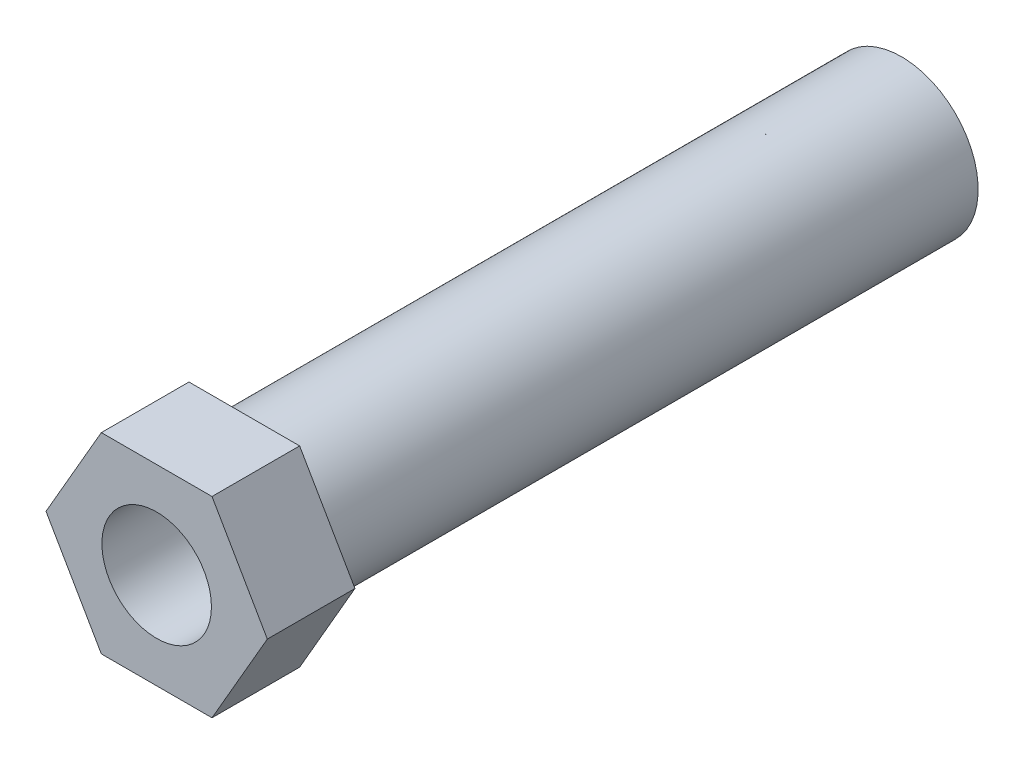
ISO-10303-21;
HEADER;
FILE_DESCRIPTION(('STEP AP214'),'2;1');
FILE_NAME('part.step','',(''),(''),'','','');
FILE_SCHEMA(('AUTOMOTIVE_DESIGN { 1 0 10303 214 1 1 1 1 }'));
ENDSEC;
DATA;
#1=APPLICATION_CONTEXT('core data for automotive mechanical design processes');
#2=APPLICATION_PROTOCOL_DEFINITION('international standard','automotive_design',2000,#1);
#3=PRODUCT_CONTEXT('',#1,'mechanical');
#4=PRODUCT('Part','Part','',(#3));
#5=PRODUCT_RELATED_PRODUCT_CATEGORY('part','',(#4));
#6=PRODUCT_DEFINITION_FORMATION('','',#4);
#7=PRODUCT_DEFINITION_CONTEXT('part definition',#1,'design');
#8=PRODUCT_DEFINITION('design','',#6,#7);
#9=PRODUCT_DEFINITION_SHAPE('','',#8);
#10=(LENGTH_UNIT() NAMED_UNIT(*) SI_UNIT(.MILLI.,.METRE.));
#11=(NAMED_UNIT(*) PLANE_ANGLE_UNIT() SI_UNIT($,.RADIAN.));
#12=(NAMED_UNIT(*) SI_UNIT($,.STERADIAN.) SOLID_ANGLE_UNIT());
#13=UNCERTAINTY_MEASURE_WITH_UNIT(LENGTH_MEASURE(1.E-05),#10,'distance_accuracy_value','');
#14=(GEOMETRIC_REPRESENTATION_CONTEXT(3) GLOBAL_UNCERTAINTY_ASSIGNED_CONTEXT((#13)) GLOBAL_UNIT_ASSIGNED_CONTEXT((#10,
#11,#12)) REPRESENTATION_CONTEXT('',''));
#15=CARTESIAN_POINT('',(0.,0.,0.));
#16=DIRECTION('',(0.,0.,1.));
#17=DIRECTION('',(1.,0.,0.));
#18=AXIS2_PLACEMENT_3D('',#15,#16,#17);
#19=CARTESIAN_POINT('',(2.5259074277046,-4.37500000000002,4.));
#20=DIRECTION('',(-0.866025403784438,0.5,0.));
#21=DIRECTION('',(-0.5,-0.866025403784438,0.));
#22=AXIS2_PLACEMENT_3D('',#19,#20,#21);
#23=PLANE('',#22);
#24=DIRECTION('',(0.5,0.866025403784438,0.));
#25=VECTOR('',#24,1.);
#26=CARTESIAN_POINT('',(2.5259074277046,-4.37500000000002,0.));
#27=LINE('',#26,#25);
#28=CARTESIAN_POINT('',(2.5259074277046,-4.37500000000002,0.));
#29=VERTEX_POINT('',#28);
#30=CARTESIAN_POINT('',(5.05181485540923,0.,0.));
#31=VERTEX_POINT('',#30);
#32=EDGE_CURVE('E132',#29,#31,#27,.T.);
#33=ORIENTED_EDGE('',*,*,#32,.T.);
#34=DIRECTION('',(0.,0.,-1.));
#35=VECTOR('',#34,1.);
#36=CARTESIAN_POINT('',(5.05181485540923,0.,4.));
#37=LINE('',#36,#35);
#38=CARTESIAN_POINT('',(5.05181485540923,0.,4.));
#39=VERTEX_POINT('',#38);
#40=EDGE_CURVE('E50',#39,#31,#37,.T.);
#41=ORIENTED_EDGE('',*,*,#40,.F.);
#42=DIRECTION('',(0.5,0.866025403784438,0.));
#43=VECTOR('',#42,1.);
#44=CARTESIAN_POINT('',(2.5259074277046,-4.37500000000002,4.));
#45=LINE('',#44,#43);
#46=CARTESIAN_POINT('',(2.5259074277046,-4.37500000000002,4.));
#47=VERTEX_POINT('',#46);
#48=EDGE_CURVE('E155',#47,#39,#45,.T.);
#49=ORIENTED_EDGE('',*,*,#48,.F.);
#50=DIRECTION('',(0.,0.,-1.));
#51=VECTOR('',#50,1.);
#52=CARTESIAN_POINT('',(2.5259074277046,-4.37500000000002,4.));
#53=LINE('',#52,#51);
#54=EDGE_CURVE('E134',#47,#29,#53,.T.);
#55=ORIENTED_EDGE('',*,*,#54,.T.);
#56=EDGE_LOOP('',(#33,#41,#49,#55));
#57=FACE_BOUND('',#56,.T.);
#58=ADVANCED_FACE('F42',(#57),#23,.F.);
#59=CARTESIAN_POINT('',(5.05181485540923,0.,4.));
#60=DIRECTION('',(-0.866025403784439,-0.5,0.));
#61=DIRECTION('',(0.5,-0.866025403784439,0.));
#62=AXIS2_PLACEMENT_3D('',#59,#60,#61);
#63=PLANE('',#62);
#64=DIRECTION('',(-0.5,0.866025403784439,0.));
#65=VECTOR('',#64,1.);
#66=CARTESIAN_POINT('',(5.05181485540923,0.,0.));
#67=LINE('',#66,#65);
#68=CARTESIAN_POINT('',(2.5259074277046,4.37500000000004,0.));
#69=VERTEX_POINT('',#68);
#70=EDGE_CURVE('E138',#31,#69,#67,.T.);
#71=ORIENTED_EDGE('',*,*,#70,.T.);
#72=DIRECTION('',(0.,0.,-1.));
#73=VECTOR('',#72,1.);
#74=CARTESIAN_POINT('',(2.5259074277046,4.37500000000004,4.));
#75=LINE('',#74,#73);
#76=CARTESIAN_POINT('',(2.5259074277046,4.37500000000004,4.));
#77=VERTEX_POINT('',#76);
#78=EDGE_CURVE('E158',#77,#69,#75,.T.);
#79=ORIENTED_EDGE('',*,*,#78,.F.);
#80=DIRECTION('',(-0.5,0.866025403784439,0.));
#81=VECTOR('',#80,1.);
#82=CARTESIAN_POINT('',(5.05181485540923,0.,4.));
#83=LINE('',#82,#81);
#84=EDGE_CURVE('E99',#39,#77,#83,.T.);
#85=ORIENTED_EDGE('',*,*,#84,.F.);
#86=ORIENTED_EDGE('',*,*,#40,.T.);
#87=EDGE_LOOP('',(#71,#79,#85,#86));
#88=FACE_BOUND('',#87,.T.);
#89=ADVANCED_FACE('F164',(#88),#63,.F.);
#90=CARTESIAN_POINT('',(2.5259074277046,4.37500000000004,4.));
#91=DIRECTION('',(0.,-1.,0.));
#92=DIRECTION('',(1.,0.,0.));
#93=AXIS2_PLACEMENT_3D('',#90,#91,#92);
#94=PLANE('',#93);
#95=DIRECTION('',(-1.,0.,0.));
#96=VECTOR('',#95,1.);
#97=CARTESIAN_POINT('',(2.5259074277046,4.37500000000004,0.));
#98=LINE('',#97,#96);
#99=CARTESIAN_POINT('',(-2.52590742770461,4.37500000000003,0.));
#100=VERTEX_POINT('',#99);
#101=EDGE_CURVE('E141',#69,#100,#98,.T.);
#102=ORIENTED_EDGE('',*,*,#101,.T.);
#103=DIRECTION('',(0.,0.,-1.));
#104=VECTOR('',#103,1.);
#105=CARTESIAN_POINT('',(-2.52590742770461,4.37500000000003,4.));
#106=LINE('',#105,#104);
#107=CARTESIAN_POINT('',(-2.52590742770461,4.37500000000003,4.));
#108=VERTEX_POINT('',#107);
#109=EDGE_CURVE('E123',#108,#100,#106,.T.);
#110=ORIENTED_EDGE('',*,*,#109,.F.);
#111=DIRECTION('',(-1.,0.,0.));
#112=VECTOR('',#111,1.);
#113=CARTESIAN_POINT('',(2.5259074277046,4.37500000000004,4.));
#114=LINE('',#113,#112);
#115=EDGE_CURVE('E114',#77,#108,#114,.T.);
#116=ORIENTED_EDGE('',*,*,#115,.F.);
#117=ORIENTED_EDGE('',*,*,#78,.T.);
#118=EDGE_LOOP('',(#102,#110,#116,#117));
#119=FACE_BOUND('',#118,.T.);
#120=ADVANCED_FACE('F174',(#119),#94,.F.);
#121=CARTESIAN_POINT('',(-2.52590742770461,4.37500000000003,4.));
#122=DIRECTION('',(0.866025403784439,-0.5,0.));
#123=DIRECTION('',(0.5,0.866025403784439,0.));
#124=AXIS2_PLACEMENT_3D('',#121,#122,#123);
#125=PLANE('',#124);
#126=DIRECTION('',(-0.5,-0.866025403784438,0.));
#127=VECTOR('',#126,1.);
#128=CARTESIAN_POINT('',(-2.52590742770461,4.37500000000003,0.));
#129=LINE('',#128,#127);
#130=CARTESIAN_POINT('',(-5.05181485540925,0.,0.));
#131=VERTEX_POINT('',#130);
#132=EDGE_CURVE('E122',#100,#131,#129,.T.);
#133=ORIENTED_EDGE('',*,*,#132,.T.);
#134=DIRECTION('',(0.,0.,-1.));
#135=VECTOR('',#134,1.);
#136=CARTESIAN_POINT('',(-5.05181485540925,0.,4.));
#137=LINE('',#136,#135);
#138=CARTESIAN_POINT('',(-5.05181485540925,0.,4.));
#139=VERTEX_POINT('',#138);
#140=EDGE_CURVE('E118',#139,#131,#137,.T.);
#141=ORIENTED_EDGE('',*,*,#140,.F.);
#142=DIRECTION('',(-0.5,-0.866025403784438,0.));
#143=VECTOR('',#142,1.);
#144=CARTESIAN_POINT('',(-2.52590742770461,4.37500000000003,4.));
#145=LINE('',#144,#143);
#146=EDGE_CURVE('E110',#108,#139,#145,.T.);
#147=ORIENTED_EDGE('',*,*,#146,.F.);
#148=ORIENTED_EDGE('',*,*,#109,.T.);
#149=EDGE_LOOP('',(#133,#141,#147,#148));
#150=FACE_BOUND('',#149,.T.);
#151=ADVANCED_FACE('F117',(#150),#125,.F.);
#152=CARTESIAN_POINT('',(-5.05181485540925,0.,4.));
#153=DIRECTION('',(0.866025403784439,0.5,0.));
#154=DIRECTION('',(-0.5,0.866025403784439,0.));
#155=AXIS2_PLACEMENT_3D('',#152,#153,#154);
#156=PLANE('',#155);
#157=DIRECTION('',(0.499999999999999,-0.866025403784439,0.));
#158=VECTOR('',#157,1.);
#159=CARTESIAN_POINT('',(-5.05181485540925,0.,0.));
#160=LINE('',#159,#158);
#161=CARTESIAN_POINT('',(-2.52590742770463,-4.37500000000002,0.));
#162=VERTEX_POINT('',#161);
#163=EDGE_CURVE('E85',#131,#162,#160,.T.);
#164=ORIENTED_EDGE('',*,*,#163,.T.);
#165=DIRECTION('',(0.,0.,-1.));
#166=VECTOR('',#165,1.);
#167=CARTESIAN_POINT('',(-2.52590742770463,-4.37500000000002,4.));
#168=LINE('',#167,#166);
#169=CARTESIAN_POINT('',(-2.52590742770463,-4.37500000000002,4.));
#170=VERTEX_POINT('',#169);
#171=EDGE_CURVE('E125',#170,#162,#168,.T.);
#172=ORIENTED_EDGE('',*,*,#171,.F.);
#173=DIRECTION('',(0.499999999999999,-0.866025403784439,0.));
#174=VECTOR('',#173,1.);
#175=CARTESIAN_POINT('',(-5.05181485540925,0.,4.));
#176=LINE('',#175,#174);
#177=EDGE_CURVE('E112',#139,#170,#176,.T.);
#178=ORIENTED_EDGE('',*,*,#177,.F.);
#179=ORIENTED_EDGE('',*,*,#140,.T.);
#180=EDGE_LOOP('',(#164,#172,#178,#179));
#181=FACE_BOUND('',#180,.T.);
#182=ADVANCED_FACE('F130',(#181),#156,.F.);
#183=CARTESIAN_POINT('',(-2.52590742770463,-4.37500000000002,4.));
#184=DIRECTION('',(0.,1.,0.));
#185=DIRECTION('',(0.,0.,1.));
#186=AXIS2_PLACEMENT_3D('',#183,#184,#185);
#187=PLANE('',#186);
#188=DIRECTION('',(1.,0.,0.));
#189=VECTOR('',#188,1.);
#190=CARTESIAN_POINT('',(-2.52590742770463,-4.37500000000002,0.));
#191=LINE('',#190,#189);
#192=EDGE_CURVE('E93',#162,#29,#191,.T.);
#193=ORIENTED_EDGE('',*,*,#192,.T.);
#194=ORIENTED_EDGE('',*,*,#54,.F.);
#195=DIRECTION('',(1.,0.,0.));
#196=VECTOR('',#195,1.);
#197=CARTESIAN_POINT('',(-2.52590742770463,-4.37500000000002,4.));
#198=LINE('',#197,#196);
#199=EDGE_CURVE('E61',#170,#47,#198,.T.);
#200=ORIENTED_EDGE('',*,*,#199,.F.);
#201=ORIENTED_EDGE('',*,*,#171,.T.);
#202=EDGE_LOOP('',(#193,#194,#200,#201));
#203=FACE_BOUND('',#202,.T.);
#204=ADVANCED_FACE('F194',(#203),#187,.F.);
#205=CARTESIAN_POINT('',(0.,0.,4.));
#206=DIRECTION('',(0.,0.,1.));
#207=DIRECTION('',(1.,0.,0.));
#208=AXIS2_PLACEMENT_3D('',#205,#206,#207);
#209=PLANE('',#208);
#210=CARTESIAN_POINT('',(0.,0.,4.));
#211=DIRECTION('',(0.,0.,1.));
#212=DIRECTION('',(1.,0.,0.));
#213=AXIS2_PLACEMENT_3D('',#210,#211,#212);
#214=CIRCLE('',#213,2.5);
#215=CARTESIAN_POINT('',(2.5,0.,4.));
#216=VERTEX_POINT('',#215);
#217=EDGE_CURVE('E183',#216,#216,#214,.T.);
#218=ORIENTED_EDGE('',*,*,#217,.F.);
#219=EDGE_LOOP('',(#218));
#220=FACE_BOUND('',#219,.T.);
#221=ORIENTED_EDGE('',*,*,#48,.T.);
#222=ORIENTED_EDGE('',*,*,#84,.T.);
#223=ORIENTED_EDGE('',*,*,#115,.T.);
#224=ORIENTED_EDGE('',*,*,#146,.T.);
#225=ORIENTED_EDGE('',*,*,#177,.T.);
#226=ORIENTED_EDGE('',*,*,#199,.T.);
#227=EDGE_LOOP('',(#221,#222,#223,#224,#225,#226));
#228=FACE_BOUND('',#227,.T.);
#229=ADVANCED_FACE('F108',(#220,#228),#209,.T.);
#230=CARTESIAN_POINT('',(0.,0.,0.));
#231=DIRECTION('',(0.,0.,1.));
#232=DIRECTION('',(1.,0.,0.));
#233=AXIS2_PLACEMENT_3D('',#230,#231,#232);
#234=PLANE('',#233);
#235=CARTESIAN_POINT('',(0.,0.,0.));
#236=DIRECTION('',(0.,0.,-1.));
#237=DIRECTION('',(-1.,0.,0.));
#238=AXIS2_PLACEMENT_3D('',#235,#236,#237);
#239=CIRCLE('',#238,3.5);
#240=CARTESIAN_POINT('',(-3.5,0.,0.));
#241=VERTEX_POINT('',#240);
#242=EDGE_CURVE('E11',#241,#241,#239,.T.);
#243=ORIENTED_EDGE('',*,*,#242,.F.);
#244=EDGE_LOOP('',(#243));
#245=FACE_BOUND('',#244,.T.);
#246=ORIENTED_EDGE('',*,*,#32,.F.);
#247=ORIENTED_EDGE('',*,*,#192,.F.);
#248=ORIENTED_EDGE('',*,*,#163,.F.);
#249=ORIENTED_EDGE('',*,*,#132,.F.);
#250=ORIENTED_EDGE('',*,*,#101,.F.);
#251=ORIENTED_EDGE('',*,*,#70,.F.);
#252=EDGE_LOOP('',(#246,#247,#248,#249,#250,#251));
#253=FACE_BOUND('',#252,.T.);
#254=ADVANCED_FACE('F168',(#245,#253),#234,.F.);
#255=CARTESIAN_POINT('',(0.,0.,-30.));
#256=DIRECTION('',(0.,0.,-1.));
#257=DIRECTION('',(-1.,0.,0.));
#258=AXIS2_PLACEMENT_3D('',#255,#256,#257);
#259=PLANE('',#258);
#260=CARTESIAN_POINT('',(0.,0.,-30.));
#261=DIRECTION('',(0.,0.,-1.));
#262=DIRECTION('',(-1.,0.,0.));
#263=AXIS2_PLACEMENT_3D('',#260,#261,#262);
#264=CIRCLE('',#263,3.5);
#265=CARTESIAN_POINT('',(-3.5,0.,-30.));
#266=VERTEX_POINT('',#265);
#267=EDGE_CURVE('E140',#266,#266,#264,.T.);
#268=ORIENTED_EDGE('',*,*,#267,.T.);
#269=EDGE_LOOP('',(#268));
#270=FACE_BOUND('',#269,.T.);
#271=CARTESIAN_POINT('',(0.,0.,-30.));
#272=DIRECTION('',(0.,0.,-1.));
#273=DIRECTION('',(-1.,0.,0.));
#274=AXIS2_PLACEMENT_3D('',#271,#272,#273);
#275=CIRCLE('',#274,2.5);
#276=CARTESIAN_POINT('',(-2.5,0.,-30.));
#277=VERTEX_POINT('',#276);
#278=EDGE_CURVE('E182',#277,#277,#275,.T.);
#279=ORIENTED_EDGE('',*,*,#278,.F.);
#280=EDGE_LOOP('',(#279));
#281=FACE_BOUND('',#280,.T.);
#282=ADVANCED_FACE('F199',(#270,#281),#259,.T.);
#283=CARTESIAN_POINT('',(0.,0.,-30.));
#284=DIRECTION('',(0.,0.,1.));
#285=DIRECTION('',(1.,0.,0.));
#286=AXIS2_PLACEMENT_3D('',#283,#284,#285);
#287=CYLINDRICAL_SURFACE('',#286,3.5);
#288=ORIENTED_EDGE('',*,*,#267,.F.);
#289=EDGE_LOOP('',(#288));
#290=FACE_BOUND('',#289,.T.);
#291=ORIENTED_EDGE('',*,*,#242,.T.);
#292=EDGE_LOOP('',(#291));
#293=FACE_BOUND('',#292,.T.);
#294=ADVANCED_FACE('F236',(#290,#293),#287,.T.);
#295=CARTESIAN_POINT('',(0.,0.,-30.));
#296=DIRECTION('',(0.,0.,1.));
#297=DIRECTION('',(1.,0.,0.));
#298=AXIS2_PLACEMENT_3D('',#295,#296,#297);
#299=CYLINDRICAL_SURFACE('',#298,2.5);
#300=ORIENTED_EDGE('',*,*,#278,.T.);
#301=EDGE_LOOP('',(#300));
#302=FACE_BOUND('',#301,.T.);
#303=ORIENTED_EDGE('',*,*,#217,.T.);
#304=EDGE_LOOP('',(#303));
#305=FACE_BOUND('',#304,.T.);
#306=ADVANCED_FACE('F187',(#302,#305),#299,.F.);
#307=CLOSED_SHELL('',(#58,#89,#120,#151,#182,#204,#229,#254,#282,#294,#306));
#308=MANIFOLD_SOLID_BREP('B2',#307);
#309=ADVANCED_BREP_SHAPE_REPRESENTATION('',(#18,#308),#14);
#310=SHAPE_DEFINITION_REPRESENTATION(#9,#309);
ENDSEC;
END-ISO-10303-21;
